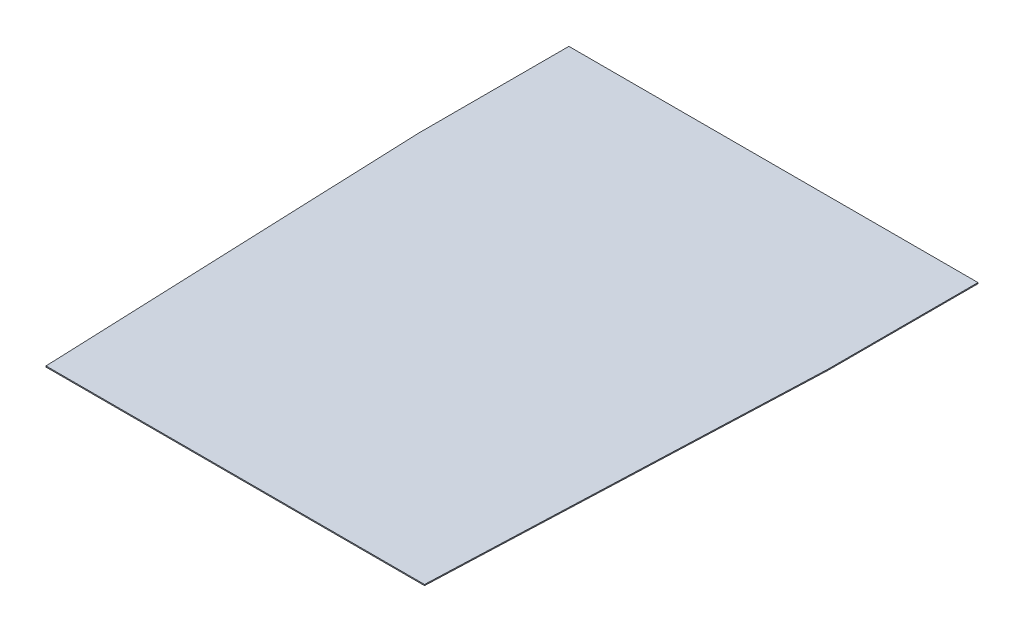
ISO-10303-21;
HEADER;
FILE_DESCRIPTION(('STEP AP214'),'2;1');
FILE_NAME('part.step','',(''),(''),'','','');
FILE_SCHEMA(('AUTOMOTIVE_DESIGN { 1 0 10303 214 1 1 1 1 }'));
ENDSEC;
DATA;
#1=APPLICATION_CONTEXT('core data for automotive mechanical design processes');
#2=APPLICATION_PROTOCOL_DEFINITION('international standard','automotive_design',2000,#1);
#3=PRODUCT_CONTEXT('',#1,'mechanical');
#4=PRODUCT('Part','Part','',(#3));
#5=PRODUCT_RELATED_PRODUCT_CATEGORY('part','',(#4));
#6=PRODUCT_DEFINITION_FORMATION('','',#4);
#7=PRODUCT_DEFINITION_CONTEXT('part definition',#1,'design');
#8=PRODUCT_DEFINITION('design','',#6,#7);
#9=PRODUCT_DEFINITION_SHAPE('','',#8);
#10=(LENGTH_UNIT() NAMED_UNIT(*) SI_UNIT(.MILLI.,.METRE.));
#11=(NAMED_UNIT(*) PLANE_ANGLE_UNIT() SI_UNIT($,.RADIAN.));
#12=(NAMED_UNIT(*) SI_UNIT($,.STERADIAN.) SOLID_ANGLE_UNIT());
#13=UNCERTAINTY_MEASURE_WITH_UNIT(LENGTH_MEASURE(1.E-05),#10,'distance_accuracy_value','');
#14=(GEOMETRIC_REPRESENTATION_CONTEXT(3) GLOBAL_UNCERTAINTY_ASSIGNED_CONTEXT((#13)) GLOBAL_UNIT_ASSIGNED_CONTEXT((#10,
#11,#12)) REPRESENTATION_CONTEXT('',''));
#15=CARTESIAN_POINT('',(0.,0.,0.));
#16=DIRECTION('',(0.,0.,1.));
#17=DIRECTION('',(1.,0.,0.));
#18=AXIS2_PLACEMENT_3D('',#15,#16,#17);
#19=CARTESIAN_POINT('',(8.62363589253637E-13,1.6,230.8));
#20=DIRECTION('',(1.,0.,0.));
#21=DIRECTION('',(0.,0.,-1.));
#22=AXIS2_PLACEMENT_3D('',#19,#20,#21);
#23=PLANE('',#22);
#24=DIRECTION('',(0.,0.,1.));
#25=VECTOR('',#24,1.);
#26=CARTESIAN_POINT('',(8.62363589253637E-13,0.,230.8));
#27=LINE('',#26,#25);
#28=CARTESIAN_POINT('',(0.,0.,0.));
#29=VERTEX_POINT('',#28);
#30=CARTESIAN_POINT('',(8.62363589253637E-13,0.,230.8));
#31=VERTEX_POINT('',#30);
#32=EDGE_CURVE('E110',#29,#31,#27,.T.);
#33=ORIENTED_EDGE('',*,*,#32,.T.);
#34=DIRECTION('',(0.,-1.,0.));
#35=VECTOR('',#34,1.);
#36=CARTESIAN_POINT('',(8.62363589253637E-13,1.6,230.8));
#37=LINE('',#36,#35);
#38=CARTESIAN_POINT('',(8.62363589253637E-13,1.6,230.8));
#39=VERTEX_POINT('',#38);
#40=EDGE_CURVE('E11',#39,#31,#37,.T.);
#41=ORIENTED_EDGE('',*,*,#40,.F.);
#42=DIRECTION('',(0.,0.,1.));
#43=VECTOR('',#42,1.);
#44=CARTESIAN_POINT('',(8.62363589253637E-13,1.6,230.8));
#45=LINE('',#44,#43);
#46=CARTESIAN_POINT('',(0.,1.6,0.));
#47=VERTEX_POINT('',#46);
#48=EDGE_CURVE('E134',#47,#39,#45,.T.);
#49=ORIENTED_EDGE('',*,*,#48,.F.);
#50=DIRECTION('',(0.,-1.,0.));
#51=VECTOR('',#50,1.);
#52=CARTESIAN_POINT('',(0.,1.6,0.));
#53=LINE('',#52,#51);
#54=EDGE_CURVE('E135',#47,#29,#53,.T.);
#55=ORIENTED_EDGE('',*,*,#54,.T.);
#56=EDGE_LOOP('',(#33,#41,#49,#55));
#57=FACE_BOUND('',#56,.T.);
#58=ADVANCED_FACE('F38',(#57),#23,.F.);
#59=CARTESIAN_POINT('',(23.4872077511517,1.6,826.1));
#60=DIRECTION('',(0.99922258244063,0.,-0.0394237332158988));
#61=DIRECTION('',(-0.0394237332158988,0.,-0.99922258244063));
#62=AXIS2_PLACEMENT_3D('',#59,#60,#61);
#63=PLANE('',#62);
#64=DIRECTION('',(0.0394237332158988,0.,0.99922258244063));
#65=VECTOR('',#64,1.);
#66=CARTESIAN_POINT('',(23.4872077511517,0.,826.1));
#67=LINE('',#66,#65);
#68=CARTESIAN_POINT('',(23.4872077511517,0.,826.1));
#69=VERTEX_POINT('',#68);
#70=EDGE_CURVE('E124',#31,#69,#67,.T.);
#71=ORIENTED_EDGE('',*,*,#70,.T.);
#72=DIRECTION('',(0.,-1.,0.));
#73=VECTOR('',#72,1.);
#74=CARTESIAN_POINT('',(23.4872077511517,1.6,826.1));
#75=LINE('',#74,#73);
#76=CARTESIAN_POINT('',(23.4872077511517,1.6,826.1));
#77=VERTEX_POINT('',#76);
#78=EDGE_CURVE('E47',#77,#69,#75,.T.);
#79=ORIENTED_EDGE('',*,*,#78,.F.);
#80=DIRECTION('',(0.0394237332158988,0.,0.99922258244063));
#81=VECTOR('',#80,1.);
#82=CARTESIAN_POINT('',(23.4872077511517,1.6,826.1));
#83=LINE('',#82,#81);
#84=EDGE_CURVE('E89',#39,#77,#83,.T.);
#85=ORIENTED_EDGE('',*,*,#84,.F.);
#86=ORIENTED_EDGE('',*,*,#40,.T.);
#87=EDGE_LOOP('',(#71,#79,#85,#86));
#88=FACE_BOUND('',#87,.T.);
#89=ADVANCED_FACE('F161',(#88),#63,.F.);
#90=CARTESIAN_POINT('',(628.,1.6,230.8));
#91=DIRECTION('',(-0.99922258244063,0.,-0.0394237332159005));
#92=DIRECTION('',(-0.0394237332159005,0.,0.99922258244063));
#93=AXIS2_PLACEMENT_3D('',#90,#91,#92);
#94=PLANE('',#93);
#95=DIRECTION('',(0.0394237332159005,0.,-0.99922258244063));
#96=VECTOR('',#95,1.);
#97=CARTESIAN_POINT('',(628.,0.,230.8));
#98=LINE('',#97,#96);
#99=CARTESIAN_POINT('',(604.512792248848,0.,826.1));
#100=VERTEX_POINT('',#99);
#101=CARTESIAN_POINT('',(628.,0.,230.8));
#102=VERTEX_POINT('',#101);
#103=EDGE_CURVE('E117',#100,#102,#98,.T.);
#104=ORIENTED_EDGE('',*,*,#103,.T.);
#105=DIRECTION('',(0.,-1.,0.));
#106=VECTOR('',#105,1.);
#107=CARTESIAN_POINT('',(628.,1.6,230.8));
#108=LINE('',#107,#106);
#109=CARTESIAN_POINT('',(628.,1.6,230.8));
#110=VERTEX_POINT('',#109);
#111=EDGE_CURVE('E120',#110,#102,#108,.T.);
#112=ORIENTED_EDGE('',*,*,#111,.F.);
#113=DIRECTION('',(0.0394237332159005,0.,-0.99922258244063));
#114=VECTOR('',#113,1.);
#115=CARTESIAN_POINT('',(628.,1.6,230.8));
#116=LINE('',#115,#114);
#117=CARTESIAN_POINT('',(604.512792248848,1.6,826.1));
#118=VERTEX_POINT('',#117);
#119=EDGE_CURVE('E118',#118,#110,#116,.T.);
#120=ORIENTED_EDGE('',*,*,#119,.F.);
#121=DIRECTION('',(0.,-1.,0.));
#122=VECTOR('',#121,1.);
#123=CARTESIAN_POINT('',(604.512792248848,1.6,826.1));
#124=LINE('',#123,#122);
#125=EDGE_CURVE('E104',#118,#100,#124,.T.);
#126=ORIENTED_EDGE('',*,*,#125,.T.);
#127=EDGE_LOOP('',(#104,#112,#120,#126));
#128=FACE_BOUND('',#127,.T.);
#129=ADVANCED_FACE('F115',(#128),#94,.F.);
#130=CARTESIAN_POINT('',(628.,1.6,0.));
#131=DIRECTION('',(-1.,0.,0.));
#132=DIRECTION('',(0.,0.,1.));
#133=AXIS2_PLACEMENT_3D('',#130,#131,#132);
#134=PLANE('',#133);
#135=DIRECTION('',(0.,0.,-1.));
#136=VECTOR('',#135,1.);
#137=CARTESIAN_POINT('',(628.,0.,0.));
#138=LINE('',#137,#136);
#139=CARTESIAN_POINT('',(628.,0.,0.));
#140=VERTEX_POINT('',#139);
#141=EDGE_CURVE('E76',#102,#140,#138,.T.);
#142=ORIENTED_EDGE('',*,*,#141,.T.);
#143=DIRECTION('',(0.,-1.,0.));
#144=VECTOR('',#143,1.);
#145=CARTESIAN_POINT('',(628.,1.6,0.));
#146=LINE('',#145,#144);
#147=CARTESIAN_POINT('',(628.,1.6,0.));
#148=VERTEX_POINT('',#147);
#149=EDGE_CURVE('E138',#148,#140,#146,.T.);
#150=ORIENTED_EDGE('',*,*,#149,.F.);
#151=DIRECTION('',(0.,0.,-1.));
#152=VECTOR('',#151,1.);
#153=CARTESIAN_POINT('',(628.,1.6,0.));
#154=LINE('',#153,#152);
#155=EDGE_CURVE('E145',#110,#148,#154,.T.);
#156=ORIENTED_EDGE('',*,*,#155,.F.);
#157=ORIENTED_EDGE('',*,*,#111,.T.);
#158=EDGE_LOOP('',(#142,#150,#156,#157));
#159=FACE_BOUND('',#158,.T.);
#160=ADVANCED_FACE('F167',(#159),#134,.F.);
#161=CARTESIAN_POINT('',(0.,1.6,0.));
#162=DIRECTION('',(0.,0.,1.));
#163=DIRECTION('',(1.,0.,0.));
#164=AXIS2_PLACEMENT_3D('',#161,#162,#163);
#165=PLANE('',#164);
#166=DIRECTION('',(-1.,0.,0.));
#167=VECTOR('',#166,1.);
#168=CARTESIAN_POINT('',(0.,0.,0.));
#169=LINE('',#168,#167);
#170=EDGE_CURVE('E82',#140,#29,#169,.T.);
#171=ORIENTED_EDGE('',*,*,#170,.T.);
#172=ORIENTED_EDGE('',*,*,#54,.F.);
#173=DIRECTION('',(-1.,0.,0.));
#174=VECTOR('',#173,1.);
#175=CARTESIAN_POINT('',(0.,1.6,0.));
#176=LINE('',#175,#174);
#177=EDGE_CURVE('E55',#148,#47,#176,.T.);
#178=ORIENTED_EDGE('',*,*,#177,.F.);
#179=ORIENTED_EDGE('',*,*,#149,.T.);
#180=EDGE_LOOP('',(#171,#172,#178,#179));
#181=FACE_BOUND('',#180,.T.);
#182=ADVANCED_FACE('F173',(#181),#165,.F.);
#183=CARTESIAN_POINT('',(0.,1.6,0.));
#184=DIRECTION('',(0.,-1.,0.));
#185=DIRECTION('',(0.,0.,-1.));
#186=AXIS2_PLACEMENT_3D('',#183,#184,#185);
#187=PLANE('',#186);
#188=ORIENTED_EDGE('',*,*,#84,.T.);
#189=DIRECTION('',(-1.,0.,0.));
#190=VECTOR('',#189,1.);
#191=CARTESIAN_POINT('',(23.4872077511517,1.6,826.1));
#192=LINE('',#191,#190);
#193=EDGE_CURVE('E111',#118,#77,#192,.T.);
#194=ORIENTED_EDGE('',*,*,#193,.F.);
#195=ORIENTED_EDGE('',*,*,#119,.T.);
#196=ORIENTED_EDGE('',*,*,#155,.T.);
#197=ORIENTED_EDGE('',*,*,#177,.T.);
#198=ORIENTED_EDGE('',*,*,#48,.T.);
#199=EDGE_LOOP('',(#188,#194,#195,#196,#197,#198));
#200=FACE_BOUND('',#199,.T.);
#201=ADVANCED_FACE('F176',(#200),#187,.F.);
#202=CARTESIAN_POINT('',(0.,0.,0.));
#203=DIRECTION('',(0.,-1.,0.));
#204=DIRECTION('',(0.,0.,-1.));
#205=AXIS2_PLACEMENT_3D('',#202,#203,#204);
#206=PLANE('',#205);
#207=DIRECTION('',(-1.,0.,0.));
#208=VECTOR('',#207,1.);
#209=CARTESIAN_POINT('',(23.4872077511517,0.,826.1));
#210=LINE('',#209,#208);
#211=EDGE_CURVE('E101',#100,#69,#210,.T.);
#212=ORIENTED_EDGE('',*,*,#211,.T.);
#213=ORIENTED_EDGE('',*,*,#70,.F.);
#214=ORIENTED_EDGE('',*,*,#32,.F.);
#215=ORIENTED_EDGE('',*,*,#170,.F.);
#216=ORIENTED_EDGE('',*,*,#141,.F.);
#217=ORIENTED_EDGE('',*,*,#103,.F.);
#218=EDGE_LOOP('',(#212,#213,#214,#215,#216,#217));
#219=FACE_BOUND('',#218,.T.);
#220=ADVANCED_FACE('F122',(#219),#206,.T.);
#221=CARTESIAN_POINT('',(23.4872077511517,0.,826.1));
#222=DIRECTION('',(0.,0.,-1.));
#223=DIRECTION('',(-1.,0.,0.));
#224=AXIS2_PLACEMENT_3D('',#221,#222,#223);
#225=PLANE('',#224);
#226=ORIENTED_EDGE('',*,*,#193,.T.);
#227=ORIENTED_EDGE('',*,*,#78,.T.);
#228=ORIENTED_EDGE('',*,*,#211,.F.);
#229=ORIENTED_EDGE('',*,*,#125,.F.);
#230=EDGE_LOOP('',(#226,#227,#228,#229));
#231=FACE_BOUND('',#230,.T.);
#232=ADVANCED_FACE('F103',(#231),#225,.F.);
#233=CLOSED_SHELL('',(#58,#89,#129,#160,#182,#201,#220,#232));
#234=MANIFOLD_SOLID_BREP('B2',#233);
#235=ADVANCED_BREP_SHAPE_REPRESENTATION('',(#18,#234),#14);
#236=SHAPE_DEFINITION_REPRESENTATION(#9,#235);
ENDSEC;
END-ISO-10303-21;
